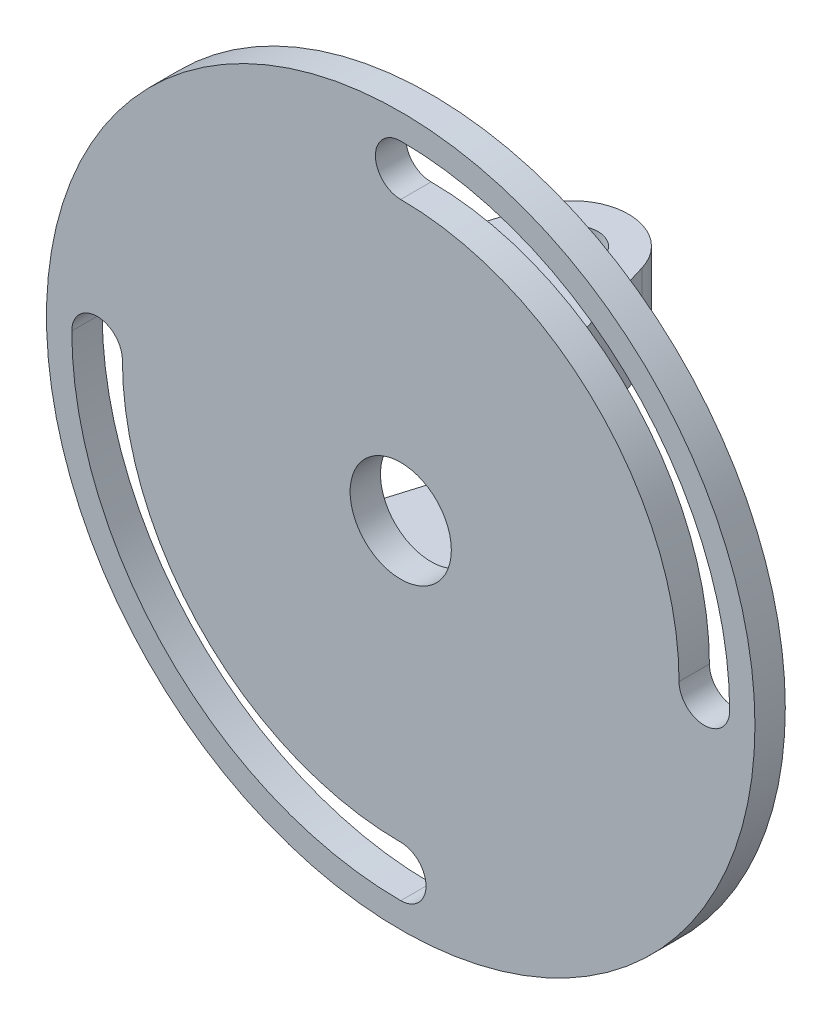
ISO-10303-21;
HEADER;
FILE_DESCRIPTION(('STEP AP214'),'2;1');
FILE_NAME('part.step','',(''),(''),'','','');
FILE_SCHEMA(('AUTOMOTIVE_DESIGN { 1 0 10303 214 1 1 1 1 }'));
ENDSEC;
DATA;
#1=APPLICATION_CONTEXT('core data for automotive mechanical design processes');
#2=APPLICATION_PROTOCOL_DEFINITION('international standard','automotive_design',2000,#1);
#3=PRODUCT_CONTEXT('',#1,'mechanical');
#4=PRODUCT('Part','Part','',(#3));
#5=PRODUCT_RELATED_PRODUCT_CATEGORY('part','',(#4));
#6=PRODUCT_DEFINITION_FORMATION('','',#4);
#7=PRODUCT_DEFINITION_CONTEXT('part definition',#1,'design');
#8=PRODUCT_DEFINITION('design','',#6,#7);
#9=PRODUCT_DEFINITION_SHAPE('','',#8);
#10=(LENGTH_UNIT() NAMED_UNIT(*) SI_UNIT(.MILLI.,.METRE.));
#11=(NAMED_UNIT(*) PLANE_ANGLE_UNIT() SI_UNIT($,.RADIAN.));
#12=(NAMED_UNIT(*) SI_UNIT($,.STERADIAN.) SOLID_ANGLE_UNIT());
#13=UNCERTAINTY_MEASURE_WITH_UNIT(LENGTH_MEASURE(1.E-05),#10,'distance_accuracy_value','');
#14=(GEOMETRIC_REPRESENTATION_CONTEXT(3) GLOBAL_UNCERTAINTY_ASSIGNED_CONTEXT((#13)) GLOBAL_UNIT_ASSIGNED_CONTEXT((#10,
#11,#12)) REPRESENTATION_CONTEXT('',''));
#15=CARTESIAN_POINT('',(0.,0.,0.));
#16=DIRECTION('',(0.,0.,1.));
#17=DIRECTION('',(1.,0.,0.));
#18=AXIS2_PLACEMENT_3D('',#15,#16,#17);
#19=CARTESIAN_POINT('',(-10.,15.,0.));
#20=DIRECTION('',(0.95684380208316,0.,0.290602715773686));
#21=DIRECTION('',(0.290602715773686,0.,-0.95684380208316));
#22=AXIS2_PLACEMENT_3D('',#19,#20,#21);
#23=PLANE('',#22);
#24=DIRECTION('',(0.,-1.,0.));
#25=VECTOR('',#24,1.);
#26=CARTESIAN_POINT('',(-10.,15.,0.));
#27=LINE('',#26,#25);
#28=CARTESIAN_POINT('',(-10.,-6.,0.));
#29=VERTEX_POINT('',#28);
#30=CARTESIAN_POINT('',(-10.,-15.,0.));
#31=VERTEX_POINT('',#30);
#32=EDGE_CURVE('E42',#29,#31,#27,.T.);
#33=ORIENTED_EDGE('',*,*,#32,.F.);
#34=DIRECTION('',(0.290602715773686,0.,-0.95684380208316));
#35=VECTOR('',#34,1.);
#36=CARTESIAN_POINT('',(-10.,-6.,0.));
#37=LINE('',#36,#35);
#38=CARTESIAN_POINT('',(-5.26264091145738,-6.,-15.5983149367553));
#39=VERTEX_POINT('',#38);
#40=EDGE_CURVE('E83',#29,#39,#37,.T.);
#41=ORIENTED_EDGE('',*,*,#40,.T.);
#42=DIRECTION('',(0.,-1.,0.));
#43=VECTOR('',#42,1.);
#44=CARTESIAN_POINT('',(-5.26264091145738,15.,-15.5983149367553));
#45=LINE('',#44,#43);
#46=CARTESIAN_POINT('',(-5.26264091145738,-15.,-15.5983149367553));
#47=VERTEX_POINT('',#46);
#48=EDGE_CURVE('E75',#39,#47,#45,.T.);
#49=ORIENTED_EDGE('',*,*,#48,.T.);
#50=DIRECTION('',(-0.290602715773686,0.,0.95684380208316));
#51=VECTOR('',#50,1.);
#52=CARTESIAN_POINT('',(-10.,-15.,0.));
#53=LINE('',#52,#51);
#54=EDGE_CURVE('E80',#47,#31,#53,.T.);
#55=ORIENTED_EDGE('',*,*,#54,.T.);
#56=EDGE_LOOP('',(#33,#41,#49,#55));
#57=FACE_BOUND('',#56,.T.);
#58=ADVANCED_FACE('F34',(#57),#23,.F.);
#59=CARTESIAN_POINT('',(10.,15.,0.));
#60=DIRECTION('',(-0.95684380208316,0.,0.290602715773686));
#61=DIRECTION('',(0.290602715773686,0.,0.95684380208316));
#62=AXIS2_PLACEMENT_3D('',#59,#60,#61);
#63=PLANE('',#62);
#64=DIRECTION('',(0.,-1.,0.));
#65=VECTOR('',#64,1.);
#66=CARTESIAN_POINT('',(5.26264091145738,15.,-15.5983149367553));
#67=LINE('',#66,#65);
#68=CARTESIAN_POINT('',(5.26264091145738,-6.,-15.5983149367553));
#69=VERTEX_POINT('',#68);
#70=CARTESIAN_POINT('',(5.26264091145738,-15.,-15.5983149367553));
#71=VERTEX_POINT('',#70);
#72=EDGE_CURVE('E92',#69,#71,#67,.T.);
#73=ORIENTED_EDGE('',*,*,#72,.F.);
#74=DIRECTION('',(0.290602715773686,0.,0.95684380208316));
#75=VECTOR('',#74,1.);
#76=CARTESIAN_POINT('',(10.,-6.,0.));
#77=LINE('',#76,#75);
#78=CARTESIAN_POINT('',(10.,-6.,0.));
#79=VERTEX_POINT('',#78);
#80=EDGE_CURVE('E132',#69,#79,#77,.T.);
#81=ORIENTED_EDGE('',*,*,#80,.T.);
#82=DIRECTION('',(0.,-1.,0.));
#83=VECTOR('',#82,1.);
#84=CARTESIAN_POINT('',(10.,15.,0.));
#85=LINE('',#84,#83);
#86=CARTESIAN_POINT('',(10.,-15.,0.));
#87=VERTEX_POINT('',#86);
#88=EDGE_CURVE('E117',#79,#87,#85,.T.);
#89=ORIENTED_EDGE('',*,*,#88,.T.);
#90=DIRECTION('',(-0.290602715773686,0.,-0.95684380208316));
#91=VECTOR('',#90,1.);
#92=CARTESIAN_POINT('',(10.,-15.,0.));
#93=LINE('',#92,#91);
#94=EDGE_CURVE('E97',#87,#71,#93,.T.);
#95=ORIENTED_EDGE('',*,*,#94,.T.);
#96=EDGE_LOOP('',(#73,#81,#89,#95));
#97=FACE_BOUND('',#96,.T.);
#98=ADVANCED_FACE('F129',(#97),#63,.F.);
#99=CARTESIAN_POINT('',(0.,15.,-14.));
#100=DIRECTION('',(0.,-1.,0.));
#101=DIRECTION('',(0.,0.,-1.));
#102=AXIS2_PLACEMENT_3D('',#99,#100,#101);
#103=CYLINDRICAL_SURFACE('',#102,5.5);
#104=ORIENTED_EDGE('',*,*,#48,.F.);
#105=CARTESIAN_POINT('',(0.,-6.,-14.));
#106=DIRECTION('',(0.,-1.,0.));
#107=DIRECTION('',(0.,0.,-1.));
#108=AXIS2_PLACEMENT_3D('',#105,#106,#107);
#109=CIRCLE('',#108,5.5);
#110=EDGE_CURVE('E222',#39,#69,#109,.T.);
#111=ORIENTED_EDGE('',*,*,#110,.T.);
#112=ORIENTED_EDGE('',*,*,#72,.T.);
#113=CARTESIAN_POINT('',(0.,-15.,-14.));
#114=DIRECTION('',(0.,1.,0.));
#115=DIRECTION('',(0.,0.,-1.));
#116=AXIS2_PLACEMENT_3D('',#113,#114,#115);
#117=CIRCLE('',#116,5.5);
#118=EDGE_CURVE('E89',#71,#47,#117,.T.);
#119=ORIENTED_EDGE('',*,*,#118,.T.);
#120=EDGE_LOOP('',(#104,#111,#112,#119));
#121=FACE_BOUND('',#120,.T.);
#122=ADVANCED_FACE('F90',(#121),#103,.T.);
#123=CARTESIAN_POINT('',(0.,15.,-14.));
#124=DIRECTION('',(0.,-1.,0.));
#125=DIRECTION('',(0.,0.,-1.));
#126=AXIS2_PLACEMENT_3D('',#123,#124,#125);
#127=CYLINDRICAL_SURFACE('',#126,2.5);
#128=CARTESIAN_POINT('',(0.,-6.,-14.));
#129=DIRECTION('',(0.,-1.,0.));
#130=DIRECTION('',(0.,0.,-1.));
#131=AXIS2_PLACEMENT_3D('',#128,#129,#130);
#132=CIRCLE('',#131,2.5);
#133=CARTESIAN_POINT('',(0.,-6.,-16.5));
#134=VERTEX_POINT('',#133);
#135=EDGE_CURVE('E218',#134,#134,#132,.T.);
#136=ORIENTED_EDGE('',*,*,#135,.F.);
#137=EDGE_LOOP('',(#136));
#138=FACE_BOUND('',#137,.T.);
#139=CARTESIAN_POINT('',(0.,-15.,-14.));
#140=DIRECTION('',(0.,1.,0.));
#141=DIRECTION('',(0.,0.,1.));
#142=AXIS2_PLACEMENT_3D('',#139,#140,#141);
#143=CIRCLE('',#142,2.5);
#144=CARTESIAN_POINT('',(0.,-15.,-11.5));
#145=VERTEX_POINT('',#144);
#146=EDGE_CURVE('E108',#145,#145,#143,.T.);
#147=ORIENTED_EDGE('',*,*,#146,.F.);
#148=EDGE_LOOP('',(#147));
#149=FACE_BOUND('',#148,.T.);
#150=ADVANCED_FACE('F340',(#138,#149),#127,.F.);
#151=CARTESIAN_POINT('',(0.,15.,-14.));
#152=DIRECTION('',(0.,-1.,0.));
#153=DIRECTION('',(0.,0.,-1.));
#154=AXIS2_PLACEMENT_3D('',#151,#152,#153);
#155=PLANE('',#154);
#156=DIRECTION('',(-0.290602715773686,0.,0.95684380208316));
#157=VECTOR('',#156,1.);
#158=CARTESIAN_POINT('',(-10.,15.,0.));
#159=LINE('',#158,#157);
#160=CARTESIAN_POINT('',(-5.26264091145738,15.,-15.5983149367553));
#161=VERTEX_POINT('',#160);
#162=CARTESIAN_POINT('',(-10.,15.,0.));
#163=VERTEX_POINT('',#162);
#164=EDGE_CURVE('E96',#161,#163,#159,.T.);
#165=ORIENTED_EDGE('',*,*,#164,.T.);
#166=DIRECTION('',(1.,0.,0.));
#167=VECTOR('',#166,1.);
#168=CARTESIAN_POINT('',(-10.,15.,0.));
#169=LINE('',#168,#167);
#170=CARTESIAN_POINT('',(10.,15.,0.));
#171=VERTEX_POINT('',#170);
#172=EDGE_CURVE('E207',#163,#171,#169,.T.);
#173=ORIENTED_EDGE('',*,*,#172,.T.);
#174=DIRECTION('',(-0.290602715773686,0.,-0.95684380208316));
#175=VECTOR('',#174,1.);
#176=CARTESIAN_POINT('',(10.,15.,0.));
#177=LINE('',#176,#175);
#178=CARTESIAN_POINT('',(5.26264091145738,15.,-15.5983149367553));
#179=VERTEX_POINT('',#178);
#180=EDGE_CURVE('E211',#171,#179,#177,.T.);
#181=ORIENTED_EDGE('',*,*,#180,.T.);
#182=CARTESIAN_POINT('',(0.,15.,-14.));
#183=DIRECTION('',(0.,1.,0.));
#184=DIRECTION('',(0.,0.,-1.));
#185=AXIS2_PLACEMENT_3D('',#182,#183,#184);
#186=CIRCLE('',#185,5.5);
#187=EDGE_CURVE('E58',#179,#161,#186,.T.);
#188=ORIENTED_EDGE('',*,*,#187,.T.);
#189=EDGE_LOOP('',(#165,#173,#181,#188));
#190=FACE_BOUND('',#189,.T.);
#191=CARTESIAN_POINT('',(0.,15.,-14.));
#192=DIRECTION('',(0.,1.,0.));
#193=DIRECTION('',(0.,0.,1.));
#194=AXIS2_PLACEMENT_3D('',#191,#192,#193);
#195=CIRCLE('',#194,2.5);
#196=CARTESIAN_POINT('',(0.,15.,-11.5));
#197=VERTEX_POINT('',#196);
#198=EDGE_CURVE('E104',#197,#197,#195,.T.);
#199=ORIENTED_EDGE('',*,*,#198,.F.);
#200=EDGE_LOOP('',(#199));
#201=FACE_BOUND('',#200,.T.);
#202=ADVANCED_FACE('F214',(#190,#201),#155,.F.);
#203=CARTESIAN_POINT('',(0.,-15.,-14.));
#204=DIRECTION('',(0.,-1.,0.));
#205=DIRECTION('',(0.,0.,-1.));
#206=AXIS2_PLACEMENT_3D('',#203,#204,#205);
#207=PLANE('',#206);
#208=ORIENTED_EDGE('',*,*,#54,.F.);
#209=ORIENTED_EDGE('',*,*,#118,.F.);
#210=ORIENTED_EDGE('',*,*,#94,.F.);
#211=DIRECTION('',(1.,0.,0.));
#212=VECTOR('',#211,1.);
#213=CARTESIAN_POINT('',(-10.,-15.,0.));
#214=LINE('',#213,#212);
#215=EDGE_CURVE('E103',#31,#87,#214,.T.);
#216=ORIENTED_EDGE('',*,*,#215,.F.);
#217=EDGE_LOOP('',(#208,#209,#210,#216));
#218=FACE_BOUND('',#217,.T.);
#219=ORIENTED_EDGE('',*,*,#146,.T.);
#220=EDGE_LOOP('',(#219));
#221=FACE_BOUND('',#220,.T.);
#222=ADVANCED_FACE('F100',(#218,#221),#207,.T.);
#223=CARTESIAN_POINT('',(-5.26264091145738,6.00000000000001,-15.5983149367553));
#224=VERTEX_POINT('',#223);
#225=EDGE_CURVE('E86',#161,#224,#45,.T.);
#226=ORIENTED_EDGE('',*,*,#225,.T.);
#227=DIRECTION('',(-0.290602715773686,0.,0.95684380208316));
#228=VECTOR('',#227,1.);
#229=CARTESIAN_POINT('',(-10.,6.,0.));
#230=LINE('',#229,#228);
#231=CARTESIAN_POINT('',(-10.,6.,0.));
#232=VERTEX_POINT('',#231);
#233=EDGE_CURVE('E49',#224,#232,#230,.T.);
#234=ORIENTED_EDGE('',*,*,#233,.T.);
#235=EDGE_CURVE('E11',#163,#232,#27,.T.);
#236=ORIENTED_EDGE('',*,*,#235,.F.);
#237=ORIENTED_EDGE('',*,*,#164,.F.);
#238=EDGE_LOOP('',(#226,#234,#236,#237));
#239=FACE_BOUND('',#238,.T.);
#240=ADVANCED_FACE('F36',(#239),#23,.F.);
#241=CARTESIAN_POINT('',(10.,6.,0.));
#242=VERTEX_POINT('',#241);
#243=EDGE_CURVE('E118',#171,#242,#85,.T.);
#244=ORIENTED_EDGE('',*,*,#243,.T.);
#245=DIRECTION('',(-0.290602715773686,0.,-0.95684380208316));
#246=VECTOR('',#245,1.);
#247=CARTESIAN_POINT('',(10.,6.,0.));
#248=LINE('',#247,#246);
#249=CARTESIAN_POINT('',(5.26264091145738,6.00000000000001,-15.5983149367553));
#250=VERTEX_POINT('',#249);
#251=EDGE_CURVE('E219',#242,#250,#248,.T.);
#252=ORIENTED_EDGE('',*,*,#251,.T.);
#253=EDGE_CURVE('E115',#179,#250,#67,.T.);
#254=ORIENTED_EDGE('',*,*,#253,.F.);
#255=ORIENTED_EDGE('',*,*,#180,.F.);
#256=EDGE_LOOP('',(#244,#252,#254,#255));
#257=FACE_BOUND('',#256,.T.);
#258=ADVANCED_FACE('F304',(#257),#63,.F.);
#259=ORIENTED_EDGE('',*,*,#253,.T.);
#260=CARTESIAN_POINT('',(0.,6.00000000000001,-14.));
#261=DIRECTION('',(0.,1.,0.));
#262=DIRECTION('',(0.,0.,1.));
#263=AXIS2_PLACEMENT_3D('',#260,#261,#262);
#264=CIRCLE('',#263,5.5);
#265=EDGE_CURVE('E224',#250,#224,#264,.T.);
#266=ORIENTED_EDGE('',*,*,#265,.T.);
#267=ORIENTED_EDGE('',*,*,#225,.F.);
#268=ORIENTED_EDGE('',*,*,#187,.F.);
#269=EDGE_LOOP('',(#259,#266,#267,#268));
#270=FACE_BOUND('',#269,.T.);
#271=ADVANCED_FACE('F306',(#270),#103,.T.);
#272=CARTESIAN_POINT('',(0.,6.00000000000001,-14.));
#273=DIRECTION('',(0.,1.,0.));
#274=DIRECTION('',(0.,0.,1.));
#275=AXIS2_PLACEMENT_3D('',#272,#273,#274);
#276=CIRCLE('',#275,2.5);
#277=CARTESIAN_POINT('',(0.,6.00000000000001,-11.5));
#278=VERTEX_POINT('',#277);
#279=EDGE_CURVE('E281',#278,#278,#276,.T.);
#280=ORIENTED_EDGE('',*,*,#279,.F.);
#281=EDGE_LOOP('',(#280));
#282=FACE_BOUND('',#281,.T.);
#283=ORIENTED_EDGE('',*,*,#198,.T.);
#284=EDGE_LOOP('',(#283));
#285=FACE_BOUND('',#284,.T.);
#286=ADVANCED_FACE('F345',(#282,#285),#127,.F.);
#287=CARTESIAN_POINT('',(0.,0.,0.));
#288=DIRECTION('',(0.,0.,1.));
#289=DIRECTION('',(1.,0.,0.));
#290=AXIS2_PLACEMENT_3D('',#287,#288,#289);
#291=PLANE('',#290);
#292=DIRECTION('',(1.,0.,0.));
#293=VECTOR('',#292,1.);
#294=CARTESIAN_POINT('',(-35.,-6.,0.));
#295=LINE('',#294,#293);
#296=EDGE_CURVE('E139',#29,#79,#295,.T.);
#297=ORIENTED_EDGE('',*,*,#296,.F.);
#298=ORIENTED_EDGE('',*,*,#32,.T.);
#299=ORIENTED_EDGE('',*,*,#215,.T.);
#300=ORIENTED_EDGE('',*,*,#88,.F.);
#301=EDGE_LOOP('',(#297,#298,#299,#300));
#302=FACE_BOUND('',#301,.T.);
#303=CARTESIAN_POINT('',(0.,0.,0.));
#304=DIRECTION('',(0.,0.,1.));
#305=DIRECTION('',(1.,0.,0.));
#306=AXIS2_PLACEMENT_3D('',#303,#304,#305);
#307=CIRCLE('',#306,32.5);
#308=CARTESIAN_POINT('',(-32.5,0.,0.));
#309=VERTEX_POINT('',#308);
#310=CARTESIAN_POINT('',(0.,-32.5,0.));
#311=VERTEX_POINT('',#310);
#312=EDGE_CURVE('E269',#309,#311,#307,.T.);
#313=ORIENTED_EDGE('',*,*,#312,.T.);
#314=CARTESIAN_POINT('',(0.,-30.0000000000001,0.));
#315=DIRECTION('',(0.,0.,1.));
#316=DIRECTION('',(1.,0.,0.));
#317=AXIS2_PLACEMENT_3D('',#314,#315,#316);
#318=CIRCLE('',#317,2.50000000000001);
#319=CARTESIAN_POINT('',(0.,-27.5,0.));
#320=VERTEX_POINT('',#319);
#321=EDGE_CURVE('E270',#311,#320,#318,.T.);
#322=ORIENTED_EDGE('',*,*,#321,.T.);
#323=CARTESIAN_POINT('',(0.,0.,0.));
#324=DIRECTION('',(0.,0.,1.));
#325=DIRECTION('',(1.,0.,0.));
#326=AXIS2_PLACEMENT_3D('',#323,#324,#325);
#327=CIRCLE('',#326,27.5);
#328=CARTESIAN_POINT('',(-27.5,0.,0.));
#329=VERTEX_POINT('',#328);
#330=EDGE_CURVE('E264',#329,#320,#327,.T.);
#331=ORIENTED_EDGE('',*,*,#330,.F.);
#332=CARTESIAN_POINT('',(-30.,0.,0.));
#333=DIRECTION('',(0.,0.,1.));
#334=DIRECTION('',(1.,0.,0.));
#335=AXIS2_PLACEMENT_3D('',#332,#333,#334);
#336=CIRCLE('',#335,2.5);
#337=EDGE_CURVE('E273',#329,#309,#336,.T.);
#338=ORIENTED_EDGE('',*,*,#337,.T.);
#339=EDGE_LOOP('',(#313,#322,#331,#338));
#340=FACE_BOUND('',#339,.T.);
#341=ORIENTED_EDGE('',*,*,#235,.T.);
#342=DIRECTION('',(1.,0.,0.));
#343=VECTOR('',#342,1.);
#344=CARTESIAN_POINT('',(-35.,6.,0.));
#345=LINE('',#344,#343);
#346=EDGE_CURVE('E310',#232,#242,#345,.T.);
#347=ORIENTED_EDGE('',*,*,#346,.T.);
#348=ORIENTED_EDGE('',*,*,#243,.F.);
#349=ORIENTED_EDGE('',*,*,#172,.F.);
#350=EDGE_LOOP('',(#341,#347,#348,#349));
#351=FACE_BOUND('',#350,.T.);
#352=CARTESIAN_POINT('',(32.5,0.,0.));
#353=VERTEX_POINT('',#352);
#354=CARTESIAN_POINT('',(0.,32.5,0.));
#355=VERTEX_POINT('',#354);
#356=EDGE_CURVE('E267',#353,#355,#307,.T.);
#357=ORIENTED_EDGE('',*,*,#356,.T.);
#358=CARTESIAN_POINT('',(0.,30.,0.));
#359=DIRECTION('',(0.,0.,1.));
#360=DIRECTION('',(1.,0.,0.));
#361=AXIS2_PLACEMENT_3D('',#358,#359,#360);
#362=CIRCLE('',#361,2.5);
#363=CARTESIAN_POINT('',(0.,27.5,0.));
#364=VERTEX_POINT('',#363);
#365=EDGE_CURVE('E263',#355,#364,#362,.T.);
#366=ORIENTED_EDGE('',*,*,#365,.T.);
#367=CARTESIAN_POINT('',(27.5,0.,0.));
#368=VERTEX_POINT('',#367);
#369=EDGE_CURVE('E261',#368,#364,#327,.T.);
#370=ORIENTED_EDGE('',*,*,#369,.F.);
#371=CARTESIAN_POINT('',(30.,0.,0.));
#372=DIRECTION('',(0.,0.,1.));
#373=DIRECTION('',(1.,0.,0.));
#374=AXIS2_PLACEMENT_3D('',#371,#372,#373);
#375=CIRCLE('',#374,2.5);
#376=EDGE_CURVE('E231',#353,#368,#375,.F.);
#377=ORIENTED_EDGE('',*,*,#376,.F.);
#378=EDGE_LOOP('',(#357,#366,#370,#377));
#379=FACE_BOUND('',#378,.T.);
#380=CARTESIAN_POINT('',(0.,0.,0.));
#381=DIRECTION('',(0.,0.,1.));
#382=DIRECTION('',(1.,0.,0.));
#383=AXIS2_PLACEMENT_3D('',#380,#381,#382);
#384=CIRCLE('',#383,35.);
#385=CARTESIAN_POINT('',(35.,0.,0.));
#386=VERTEX_POINT('',#385);
#387=EDGE_CURVE('E236',#386,#386,#384,.T.);
#388=ORIENTED_EDGE('',*,*,#387,.F.);
#389=EDGE_LOOP('',(#388));
#390=FACE_BOUND('',#389,.T.);
#391=CARTESIAN_POINT('',(0.,0.,0.));
#392=DIRECTION('',(0.,0.,1.));
#393=DIRECTION('',(1.,0.,0.));
#394=AXIS2_PLACEMENT_3D('',#391,#392,#393);
#395=CIRCLE('',#394,5.);
#396=CARTESIAN_POINT('',(5.,0.,0.));
#397=VERTEX_POINT('',#396);
#398=EDGE_CURVE('E278',#397,#397,#395,.T.);
#399=ORIENTED_EDGE('',*,*,#398,.T.);
#400=EDGE_LOOP('',(#399));
#401=FACE_BOUND('',#400,.T.);
#402=ADVANCED_FACE('F135',(#302,#340,#351,#379,#390,#401),#291,.F.);
#403=CARTESIAN_POINT('',(0.,0.,3.));
#404=DIRECTION('',(0.,0.,-1.));
#405=DIRECTION('',(-1.,0.,0.));
#406=AXIS2_PLACEMENT_3D('',#403,#404,#405);
#407=CYLINDRICAL_SURFACE('',#406,27.5);
#408=ORIENTED_EDGE('',*,*,#330,.T.);
#409=DIRECTION('',(0.,0.,-1.));
#410=VECTOR('',#409,1.);
#411=CARTESIAN_POINT('',(0.,-27.5,3.));
#412=LINE('',#411,#410);
#413=CARTESIAN_POINT('',(0.,-27.5,3.));
#414=VERTEX_POINT('',#413);
#415=EDGE_CURVE('E290',#414,#320,#412,.T.);
#416=ORIENTED_EDGE('',*,*,#415,.F.);
#417=CARTESIAN_POINT('',(0.,0.,3.));
#418=DIRECTION('',(0.,0.,1.));
#419=DIRECTION('',(1.,0.,0.));
#420=AXIS2_PLACEMENT_3D('',#417,#418,#419);
#421=CIRCLE('',#420,27.5);
#422=CARTESIAN_POINT('',(-27.5,0.,3.));
#423=VERTEX_POINT('',#422);
#424=EDGE_CURVE('E239',#423,#414,#421,.T.);
#425=ORIENTED_EDGE('',*,*,#424,.F.);
#426=DIRECTION('',(0.,0.,-1.));
#427=VECTOR('',#426,1.);
#428=CARTESIAN_POINT('',(-27.5,0.,3.));
#429=LINE('',#428,#427);
#430=EDGE_CURVE('E282',#423,#329,#429,.T.);
#431=ORIENTED_EDGE('',*,*,#430,.T.);
#432=EDGE_LOOP('',(#408,#416,#425,#431));
#433=FACE_BOUND('',#432,.T.);
#434=ADVANCED_FACE('F371',(#433),#407,.T.);
#435=CARTESIAN_POINT('',(0.,-30.0000000000001,3.));
#436=DIRECTION('',(0.,0.,-1.));
#437=DIRECTION('',(-1.,0.,0.));
#438=AXIS2_PLACEMENT_3D('',#435,#436,#437);
#439=CYLINDRICAL_SURFACE('',#438,2.50000000000001);
#440=ORIENTED_EDGE('',*,*,#321,.F.);
#441=DIRECTION('',(0.,0.,-1.));
#442=VECTOR('',#441,1.);
#443=CARTESIAN_POINT('',(0.,-32.5,3.));
#444=LINE('',#443,#442);
#445=CARTESIAN_POINT('',(0.,-32.5,3.));
#446=VERTEX_POINT('',#445);
#447=EDGE_CURVE('E287',#446,#311,#444,.T.);
#448=ORIENTED_EDGE('',*,*,#447,.F.);
#449=CARTESIAN_POINT('',(0.,-30.0000000000001,3.));
#450=DIRECTION('',(0.,0.,1.));
#451=DIRECTION('',(1.,0.,0.));
#452=AXIS2_PLACEMENT_3D('',#449,#450,#451);
#453=CIRCLE('',#452,2.50000000000001);
#454=EDGE_CURVE('E246',#446,#414,#453,.T.);
#455=ORIENTED_EDGE('',*,*,#454,.T.);
#456=ORIENTED_EDGE('',*,*,#415,.T.);
#457=EDGE_LOOP('',(#440,#448,#455,#456));
#458=FACE_BOUND('',#457,.T.);
#459=ADVANCED_FACE('F374',(#458),#439,.F.);
#460=CARTESIAN_POINT('',(0.,0.,3.));
#461=DIRECTION('',(0.,0.,-1.));
#462=DIRECTION('',(-1.,0.,0.));
#463=AXIS2_PLACEMENT_3D('',#460,#461,#462);
#464=CYLINDRICAL_SURFACE('',#463,32.5);
#465=ORIENTED_EDGE('',*,*,#312,.F.);
#466=DIRECTION('',(0.,0.,-1.));
#467=VECTOR('',#466,1.);
#468=CARTESIAN_POINT('',(-32.5,0.,3.));
#469=LINE('',#468,#467);
#470=CARTESIAN_POINT('',(-32.5,0.,3.));
#471=VERTEX_POINT('',#470);
#472=EDGE_CURVE('E284',#471,#309,#469,.T.);
#473=ORIENTED_EDGE('',*,*,#472,.F.);
#474=CARTESIAN_POINT('',(0.,0.,3.));
#475=DIRECTION('',(0.,0.,1.));
#476=DIRECTION('',(1.,0.,0.));
#477=AXIS2_PLACEMENT_3D('',#474,#475,#476);
#478=CIRCLE('',#477,32.5);
#479=EDGE_CURVE('E245',#471,#446,#478,.T.);
#480=ORIENTED_EDGE('',*,*,#479,.T.);
#481=ORIENTED_EDGE('',*,*,#447,.T.);
#482=EDGE_LOOP('',(#465,#473,#480,#481));
#483=FACE_BOUND('',#482,.T.);
#484=ADVANCED_FACE('F364',(#483),#464,.F.);
#485=CARTESIAN_POINT('',(30.,0.,3.));
#486=DIRECTION('',(0.,0.,-1.));
#487=DIRECTION('',(-1.,0.,0.));
#488=AXIS2_PLACEMENT_3D('',#485,#486,#487);
#489=CYLINDRICAL_SURFACE('',#488,2.5);
#490=ORIENTED_EDGE('',*,*,#376,.T.);
#491=DIRECTION('',(0.,0.,-1.));
#492=VECTOR('',#491,1.);
#493=CARTESIAN_POINT('',(27.5,0.,3.));
#494=LINE('',#493,#492);
#495=CARTESIAN_POINT('',(27.5,0.,3.));
#496=VERTEX_POINT('',#495);
#497=EDGE_CURVE('E285',#496,#368,#494,.T.);
#498=ORIENTED_EDGE('',*,*,#497,.F.);
#499=CARTESIAN_POINT('',(30.,0.,3.));
#500=DIRECTION('',(0.,0.,1.));
#501=DIRECTION('',(1.,0.,0.));
#502=AXIS2_PLACEMENT_3D('',#499,#500,#501);
#503=CIRCLE('',#502,2.5);
#504=CARTESIAN_POINT('',(32.5,0.,3.));
#505=VERTEX_POINT('',#504);
#506=EDGE_CURVE('E232',#505,#496,#503,.F.);
#507=ORIENTED_EDGE('',*,*,#506,.F.);
#508=DIRECTION('',(0.,0.,-1.));
#509=VECTOR('',#508,1.);
#510=CARTESIAN_POINT('',(32.5,0.,3.));
#511=LINE('',#510,#509);
#512=EDGE_CURVE('E258',#505,#353,#511,.T.);
#513=ORIENTED_EDGE('',*,*,#512,.T.);
#514=EDGE_LOOP('',(#490,#498,#507,#513));
#515=FACE_BOUND('',#514,.T.);
#516=ADVANCED_FACE('F360',(#515),#489,.F.);
#517=ORIENTED_EDGE('',*,*,#369,.T.);
#518=DIRECTION('',(0.,0.,-1.));
#519=VECTOR('',#518,1.);
#520=CARTESIAN_POINT('',(0.,27.5,3.));
#521=LINE('',#520,#519);
#522=CARTESIAN_POINT('',(0.,27.5,3.));
#523=VERTEX_POINT('',#522);
#524=EDGE_CURVE('E297',#523,#364,#521,.T.);
#525=ORIENTED_EDGE('',*,*,#524,.F.);
#526=EDGE_CURVE('E235',#496,#523,#421,.T.);
#527=ORIENTED_EDGE('',*,*,#526,.F.);
#528=ORIENTED_EDGE('',*,*,#497,.T.);
#529=EDGE_LOOP('',(#517,#525,#527,#528));
#530=FACE_BOUND('',#529,.T.);
#531=ADVANCED_FACE('F363',(#530),#407,.T.);
#532=CARTESIAN_POINT('',(0.,30.,3.));
#533=DIRECTION('',(0.,0.,-1.));
#534=DIRECTION('',(-1.,0.,0.));
#535=AXIS2_PLACEMENT_3D('',#532,#533,#534);
#536=CYLINDRICAL_SURFACE('',#535,2.5);
#537=ORIENTED_EDGE('',*,*,#365,.F.);
#538=DIRECTION('',(0.,0.,-1.));
#539=VECTOR('',#538,1.);
#540=CARTESIAN_POINT('',(0.,32.5,3.));
#541=LINE('',#540,#539);
#542=CARTESIAN_POINT('',(0.,32.5,3.));
#543=VERTEX_POINT('',#542);
#544=EDGE_CURVE('E294',#543,#355,#541,.T.);
#545=ORIENTED_EDGE('',*,*,#544,.F.);
#546=CARTESIAN_POINT('',(0.,30.,3.));
#547=DIRECTION('',(0.,0.,1.));
#548=DIRECTION('',(1.,0.,0.));
#549=AXIS2_PLACEMENT_3D('',#546,#547,#548);
#550=CIRCLE('',#549,2.5);
#551=EDGE_CURVE('E238',#543,#523,#550,.T.);
#552=ORIENTED_EDGE('',*,*,#551,.T.);
#553=ORIENTED_EDGE('',*,*,#524,.T.);
#554=EDGE_LOOP('',(#537,#545,#552,#553));
#555=FACE_BOUND('',#554,.T.);
#556=ADVANCED_FACE('F366',(#555),#536,.F.);
#557=CARTESIAN_POINT('',(0.,0.,3.));
#558=DIRECTION('',(0.,0.,-1.));
#559=DIRECTION('',(-1.,0.,0.));
#560=AXIS2_PLACEMENT_3D('',#557,#558,#559);
#561=CYLINDRICAL_SURFACE('',#560,35.);
#562=CARTESIAN_POINT('',(0.,0.,3.));
#563=DIRECTION('',(0.,0.,1.));
#564=DIRECTION('',(1.,0.,0.));
#565=AXIS2_PLACEMENT_3D('',#562,#563,#564);
#566=CIRCLE('',#565,35.);
#567=CARTESIAN_POINT('',(35.,0.,3.));
#568=VERTEX_POINT('',#567);
#569=EDGE_CURVE('E252',#568,#568,#566,.T.);
#570=ORIENTED_EDGE('',*,*,#569,.F.);
#571=EDGE_LOOP('',(#570));
#572=FACE_BOUND('',#571,.T.);
#573=ORIENTED_EDGE('',*,*,#387,.T.);
#574=EDGE_LOOP('',(#573));
#575=FACE_BOUND('',#574,.T.);
#576=ADVANCED_FACE('F369',(#572,#575),#561,.T.);
#577=CARTESIAN_POINT('',(-30.,0.,3.));
#578=DIRECTION('',(0.,0.,-1.));
#579=DIRECTION('',(-1.,0.,0.));
#580=AXIS2_PLACEMENT_3D('',#577,#578,#579);
#581=CYLINDRICAL_SURFACE('',#580,2.5);
#582=ORIENTED_EDGE('',*,*,#337,.F.);
#583=ORIENTED_EDGE('',*,*,#430,.F.);
#584=CARTESIAN_POINT('',(-30.,0.,3.));
#585=DIRECTION('',(0.,0.,1.));
#586=DIRECTION('',(1.,0.,0.));
#587=AXIS2_PLACEMENT_3D('',#584,#585,#586);
#588=CIRCLE('',#587,2.5);
#589=EDGE_CURVE('E249',#423,#471,#588,.T.);
#590=ORIENTED_EDGE('',*,*,#589,.T.);
#591=ORIENTED_EDGE('',*,*,#472,.T.);
#592=EDGE_LOOP('',(#582,#583,#590,#591));
#593=FACE_BOUND('',#592,.T.);
#594=ADVANCED_FACE('F383',(#593),#581,.F.);
#595=ORIENTED_EDGE('',*,*,#356,.F.);
#596=ORIENTED_EDGE('',*,*,#512,.F.);
#597=EDGE_CURVE('E242',#505,#543,#478,.T.);
#598=ORIENTED_EDGE('',*,*,#597,.T.);
#599=ORIENTED_EDGE('',*,*,#544,.T.);
#600=EDGE_LOOP('',(#595,#596,#598,#599));
#601=FACE_BOUND('',#600,.T.);
#602=ADVANCED_FACE('F382',(#601),#464,.F.);
#603=CARTESIAN_POINT('',(0.,0.,3.));
#604=DIRECTION('',(0.,0.,-1.));
#605=DIRECTION('',(-1.,0.,0.));
#606=AXIS2_PLACEMENT_3D('',#603,#604,#605);
#607=CYLINDRICAL_SURFACE('',#606,5.);
#608=CARTESIAN_POINT('',(0.,0.,3.));
#609=DIRECTION('',(0.,0.,1.));
#610=DIRECTION('',(1.,0.,0.));
#611=AXIS2_PLACEMENT_3D('',#608,#609,#610);
#612=CIRCLE('',#611,5.);
#613=CARTESIAN_POINT('',(5.,0.,3.));
#614=VERTEX_POINT('',#613);
#615=EDGE_CURVE('E255',#614,#614,#612,.T.);
#616=ORIENTED_EDGE('',*,*,#615,.T.);
#617=EDGE_LOOP('',(#616));
#618=FACE_BOUND('',#617,.T.);
#619=ORIENTED_EDGE('',*,*,#398,.F.);
#620=EDGE_LOOP('',(#619));
#621=FACE_BOUND('',#620,.T.);
#622=ADVANCED_FACE('F324',(#618,#621),#607,.F.);
#623=CARTESIAN_POINT('',(0.,0.,3.));
#624=DIRECTION('',(0.,0.,1.));
#625=DIRECTION('',(1.,0.,0.));
#626=AXIS2_PLACEMENT_3D('',#623,#624,#625);
#627=PLANE('',#626);
#628=ORIENTED_EDGE('',*,*,#506,.T.);
#629=ORIENTED_EDGE('',*,*,#526,.T.);
#630=ORIENTED_EDGE('',*,*,#551,.F.);
#631=ORIENTED_EDGE('',*,*,#597,.F.);
#632=EDGE_LOOP('',(#628,#629,#630,#631));
#633=FACE_BOUND('',#632,.T.);
#634=ORIENTED_EDGE('',*,*,#424,.T.);
#635=ORIENTED_EDGE('',*,*,#454,.F.);
#636=ORIENTED_EDGE('',*,*,#479,.F.);
#637=ORIENTED_EDGE('',*,*,#589,.F.);
#638=EDGE_LOOP('',(#634,#635,#636,#637));
#639=FACE_BOUND('',#638,.T.);
#640=ORIENTED_EDGE('',*,*,#569,.T.);
#641=EDGE_LOOP('',(#640));
#642=FACE_BOUND('',#641,.T.);
#643=ORIENTED_EDGE('',*,*,#615,.F.);
#644=EDGE_LOOP('',(#643));
#645=FACE_BOUND('',#644,.T.);
#646=ADVANCED_FACE('F315',(#633,#639,#642,#645),#627,.T.);
#647=CARTESIAN_POINT('',(-35.,-6.,0.));
#648=DIRECTION('',(0.,-1.,0.));
#649=DIRECTION('',(0.,0.,-1.));
#650=AXIS2_PLACEMENT_3D('',#647,#648,#649);
#651=PLANE('',#650);
#652=ORIENTED_EDGE('',*,*,#135,.T.);
#653=EDGE_LOOP('',(#652));
#654=FACE_BOUND('',#653,.T.);
#655=ORIENTED_EDGE('',*,*,#296,.T.);
#656=ORIENTED_EDGE('',*,*,#80,.F.);
#657=ORIENTED_EDGE('',*,*,#110,.F.);
#658=ORIENTED_EDGE('',*,*,#40,.F.);
#659=EDGE_LOOP('',(#655,#656,#657,#658));
#660=FACE_BOUND('',#659,.T.);
#661=ADVANCED_FACE('F312',(#654,#660),#651,.F.);
#662=CARTESIAN_POINT('',(-35.,6.00000000000002,-25.));
#663=DIRECTION('',(0.,1.,0.));
#664=DIRECTION('',(0.,0.,1.));
#665=AXIS2_PLACEMENT_3D('',#662,#663,#664);
#666=PLANE('',#665);
#667=ORIENTED_EDGE('',*,*,#279,.T.);
#668=EDGE_LOOP('',(#667));
#669=FACE_BOUND('',#668,.T.);
#670=ORIENTED_EDGE('',*,*,#265,.F.);
#671=ORIENTED_EDGE('',*,*,#251,.F.);
#672=ORIENTED_EDGE('',*,*,#346,.F.);
#673=ORIENTED_EDGE('',*,*,#233,.F.);
#674=EDGE_LOOP('',(#670,#671,#672,#673));
#675=FACE_BOUND('',#674,.T.);
#676=ADVANCED_FACE('F314',(#669,#675),#666,.F.);
#677=CLOSED_SHELL('',(#58,#98,#122,#150,#202,#222,#240,#258,#271,#286,#402,#434,#459,#484,#516,
#531,#556,#576,#594,#602,#622,#646,#661,#676));
#678=MANIFOLD_SOLID_BREP('B2',#677);
#679=ADVANCED_BREP_SHAPE_REPRESENTATION('',(#18,#678),#14);
#680=SHAPE_DEFINITION_REPRESENTATION(#9,#679);
ENDSEC;
END-ISO-10303-21;
